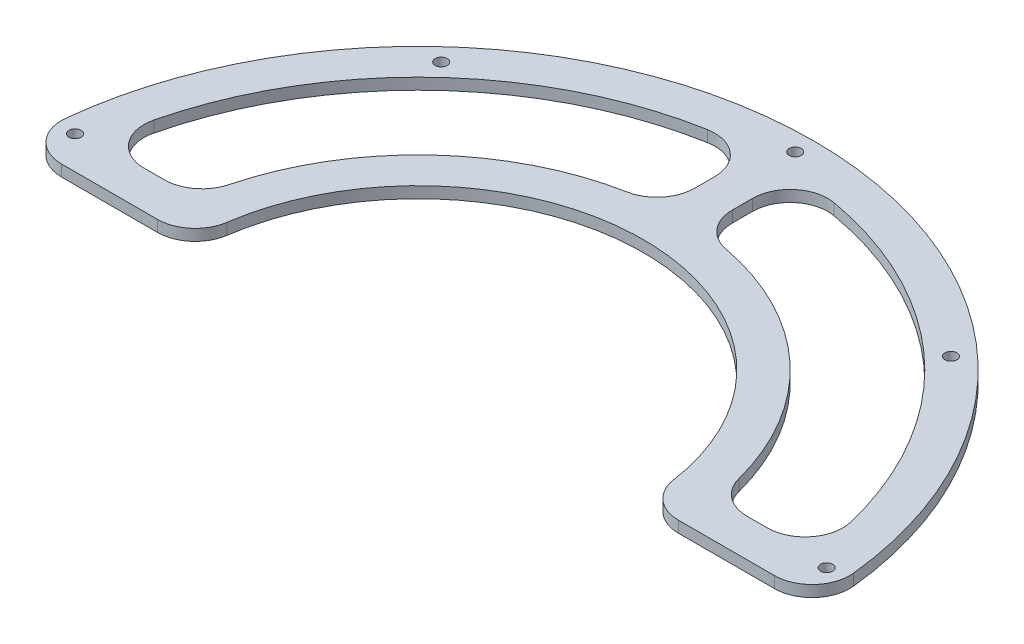
ISO-10303-21;
HEADER;
FILE_DESCRIPTION(('STEP AP214'),'2;1');
FILE_NAME('part.step','',(''),(''),'','','');
FILE_SCHEMA(('AUTOMOTIVE_DESIGN { 1 0 10303 214 1 1 1 1 }'));
ENDSEC;
DATA;
#1=APPLICATION_CONTEXT('core data for automotive mechanical design processes');
#2=APPLICATION_PROTOCOL_DEFINITION('international standard','automotive_design',2000,#1);
#3=PRODUCT_CONTEXT('',#1,'mechanical');
#4=PRODUCT('Part','Part','',(#3));
#5=PRODUCT_RELATED_PRODUCT_CATEGORY('part','',(#4));
#6=PRODUCT_DEFINITION_FORMATION('','',#4);
#7=PRODUCT_DEFINITION_CONTEXT('part definition',#1,'design');
#8=PRODUCT_DEFINITION('design','',#6,#7);
#9=PRODUCT_DEFINITION_SHAPE('','',#8);
#10=(LENGTH_UNIT() NAMED_UNIT(*) SI_UNIT(.MILLI.,.METRE.));
#11=(NAMED_UNIT(*) PLANE_ANGLE_UNIT() SI_UNIT($,.RADIAN.));
#12=(NAMED_UNIT(*) SI_UNIT($,.STERADIAN.) SOLID_ANGLE_UNIT());
#13=UNCERTAINTY_MEASURE_WITH_UNIT(LENGTH_MEASURE(1.E-05),#10,'distance_accuracy_value','');
#14=(GEOMETRIC_REPRESENTATION_CONTEXT(3) GLOBAL_UNCERTAINTY_ASSIGNED_CONTEXT((#13)) GLOBAL_UNIT_ASSIGNED_CONTEXT((#10,
#11,#12)) REPRESENTATION_CONTEXT('',''));
#15=CARTESIAN_POINT('',(0.,0.,0.));
#16=DIRECTION('',(0.,0.,1.));
#17=DIRECTION('',(1.,0.,0.));
#18=AXIS2_PLACEMENT_3D('',#15,#16,#17);
#19=CARTESIAN_POINT('',(15.,3.,-83.6660026534075));
#20=DIRECTION('',(0.,-1.,0.));
#21=DIRECTION('',(0.,0.,-1.));
#22=AXIS2_PLACEMENT_3D('',#19,#20,#21);
#23=CYLINDRICAL_SURFACE('',#22,9.99999999999999);
#24=CARTESIAN_POINT('',(15.,0.,-83.6660026534075));
#25=DIRECTION('',(0.,1.,0.));
#26=DIRECTION('',(0.,0.,1.));
#27=AXIS2_PLACEMENT_3D('',#24,#25,#26);
#28=CIRCLE('',#27,9.99999999999999);
#29=CARTESIAN_POINT('',(16.764705882353,0.,-93.5090617891025));
#30=VERTEX_POINT('',#29);
#31=CARTESIAN_POINT('',(5.,0.,-83.6660026534075));
#32=VERTEX_POINT('',#31);
#33=EDGE_CURVE('E353',#30,#32,#28,.T.);
#34=ORIENTED_EDGE('',*,*,#33,.F.);
#35=DIRECTION('',(0.,-1.,0.));
#36=VECTOR('',#35,1.);
#37=CARTESIAN_POINT('',(16.764705882353,3.,-93.5090617891025));
#38=LINE('',#37,#36);
#39=CARTESIAN_POINT('',(16.764705882353,3.,-93.5090617891025));
#40=VERTEX_POINT('',#39);
#41=EDGE_CURVE('E11',#40,#30,#38,.T.);
#42=ORIENTED_EDGE('',*,*,#41,.F.);
#43=CARTESIAN_POINT('',(15.,3.,-83.6660026534075));
#44=DIRECTION('',(0.,1.,0.));
#45=DIRECTION('',(0.,0.,1.));
#46=AXIS2_PLACEMENT_3D('',#43,#44,#45);
#47=CIRCLE('',#46,9.99999999999999);
#48=CARTESIAN_POINT('',(5.,3.,-83.6660026534075));
#49=VERTEX_POINT('',#48);
#50=EDGE_CURVE('E427',#40,#49,#47,.T.);
#51=ORIENTED_EDGE('',*,*,#50,.T.);
#52=DIRECTION('',(0.,-1.,0.));
#53=VECTOR('',#52,1.);
#54=CARTESIAN_POINT('',(5.,3.,-83.6660026534075));
#55=LINE('',#54,#53);
#56=EDGE_CURVE('E142',#49,#32,#55,.T.);
#57=ORIENTED_EDGE('',*,*,#56,.T.);
#58=EDGE_LOOP('',(#34,#42,#51,#57));
#59=FACE_BOUND('',#58,.T.);
#60=ADVANCED_FACE('F41',(#59),#23,.F.);
#61=CARTESIAN_POINT('',(0.,3.,0.));
#62=DIRECTION('',(0.,-1.,0.));
#63=DIRECTION('',(0.,0.,-1.));
#64=AXIS2_PLACEMENT_3D('',#61,#62,#63);
#65=CYLINDRICAL_SURFACE('',#64,95.);
#66=CARTESIAN_POINT('',(0.,0.,0.));
#67=DIRECTION('',(0.,1.,0.));
#68=DIRECTION('',(0.,0.,1.));
#69=AXIS2_PLACEMENT_3D('',#66,#67,#68);
#70=CIRCLE('',#69,95.);
#71=CARTESIAN_POINT('',(92.3328003515611,0.,-22.3529411764706));
#72=VERTEX_POINT('',#71);
#73=EDGE_CURVE('E355',#72,#30,#70,.T.);
#74=ORIENTED_EDGE('',*,*,#73,.F.);
#75=DIRECTION('',(0.,-1.,0.));
#76=VECTOR('',#75,1.);
#77=CARTESIAN_POINT('',(92.3328003515611,3.,-22.3529411764706));
#78=LINE('',#77,#76);
#79=CARTESIAN_POINT('',(92.3328003515611,3.,-22.3529411764706));
#80=VERTEX_POINT('',#79);
#81=EDGE_CURVE('E51',#80,#72,#78,.T.);
#82=ORIENTED_EDGE('',*,*,#81,.F.);
#83=CARTESIAN_POINT('',(0.,3.,0.));
#84=DIRECTION('',(0.,1.,0.));
#85=DIRECTION('',(0.,0.,1.));
#86=AXIS2_PLACEMENT_3D('',#83,#84,#85);
#87=CIRCLE('',#86,95.);
#88=EDGE_CURVE('E429',#80,#40,#87,.T.);
#89=ORIENTED_EDGE('',*,*,#88,.T.);
#90=ORIENTED_EDGE('',*,*,#41,.T.);
#91=EDGE_LOOP('',(#74,#82,#89,#90));
#92=FACE_BOUND('',#91,.T.);
#93=ADVANCED_FACE('F459',(#92),#65,.F.);
#94=CARTESIAN_POINT('',(82.6135582092915,3.,-20.));
#95=DIRECTION('',(0.,-1.,0.));
#96=DIRECTION('',(0.,0.,-1.));
#97=AXIS2_PLACEMENT_3D('',#94,#95,#96);
#98=CYLINDRICAL_SURFACE('',#97,10.);
#99=CARTESIAN_POINT('',(82.6135582092915,0.,-20.));
#100=DIRECTION('',(0.,1.,0.));
#101=DIRECTION('',(0.,0.,1.));
#102=AXIS2_PLACEMENT_3D('',#99,#100,#101);
#103=CIRCLE('',#102,10.);
#104=CARTESIAN_POINT('',(82.6135582092915,0.,-10.));
#105=VERTEX_POINT('',#104);
#106=EDGE_CURVE('E358',#105,#72,#103,.T.);
#107=ORIENTED_EDGE('',*,*,#106,.F.);
#108=DIRECTION('',(0.,-1.,0.));
#109=VECTOR('',#108,1.);
#110=CARTESIAN_POINT('',(82.6135582092915,3.,-10.));
#111=LINE('',#110,#109);
#112=CARTESIAN_POINT('',(82.6135582092915,3.,-10.));
#113=VERTEX_POINT('',#112);
#114=EDGE_CURVE('E242',#113,#105,#111,.T.);
#115=ORIENTED_EDGE('',*,*,#114,.F.);
#116=CARTESIAN_POINT('',(82.6135582092915,3.,-20.));
#117=DIRECTION('',(0.,1.,0.));
#118=DIRECTION('',(0.,0.,1.));
#119=AXIS2_PLACEMENT_3D('',#116,#117,#118);
#120=CIRCLE('',#119,10.);
#121=EDGE_CURVE('E432',#113,#80,#120,.T.);
#122=ORIENTED_EDGE('',*,*,#121,.T.);
#123=ORIENTED_EDGE('',*,*,#81,.T.);
#124=EDGE_LOOP('',(#107,#115,#122,#123));
#125=FACE_BOUND('',#124,.T.);
#126=ADVANCED_FACE('F445',(#125),#98,.F.);
#127=CARTESIAN_POINT('',(0.,3.,-10.));
#128=DIRECTION('',(0.,0.,-1.));
#129=DIRECTION('',(-1.,0.,0.));
#130=AXIS2_PLACEMENT_3D('',#127,#128,#129);
#131=PLANE('',#130);
#132=DIRECTION('',(1.,0.,0.));
#133=VECTOR('',#132,1.);
#134=CARTESIAN_POINT('',(0.,0.,-10.));
#135=LINE('',#134,#133);
#136=CARTESIAN_POINT('',(77.2221011110161,0.,-10.));
#137=VERTEX_POINT('',#136);
#138=EDGE_CURVE('E361',#137,#105,#135,.T.);
#139=ORIENTED_EDGE('',*,*,#138,.F.);
#140=DIRECTION('',(0.,-1.,0.));
#141=VECTOR('',#140,1.);
#142=CARTESIAN_POINT('',(77.2221011110161,3.,-10.));
#143=LINE('',#142,#141);
#144=CARTESIAN_POINT('',(77.2221011110161,3.,-10.));
#145=VERTEX_POINT('',#144);
#146=EDGE_CURVE('E236',#145,#137,#143,.T.);
#147=ORIENTED_EDGE('',*,*,#146,.F.);
#148=DIRECTION('',(1.,0.,0.));
#149=VECTOR('',#148,1.);
#150=CARTESIAN_POINT('',(0.,3.,-10.));
#151=LINE('',#150,#149);
#152=EDGE_CURVE('E435',#145,#113,#151,.T.);
#153=ORIENTED_EDGE('',*,*,#152,.T.);
#154=ORIENTED_EDGE('',*,*,#114,.T.);
#155=EDGE_LOOP('',(#139,#147,#153,#154));
#156=FACE_BOUND('',#155,.T.);
#157=ADVANCED_FACE('F440',(#156),#131,.T.);
#158=CARTESIAN_POINT('',(77.2221011110161,3.,-20.));
#159=DIRECTION('',(0.,-1.,0.));
#160=DIRECTION('',(0.,0.,-1.));
#161=AXIS2_PLACEMENT_3D('',#158,#159,#160);
#162=CYLINDRICAL_SURFACE('',#161,9.99999999999999);
#163=CARTESIAN_POINT('',(77.2221011110161,0.,-20.));
#164=DIRECTION('',(0.,1.,0.));
#165=DIRECTION('',(0.,0.,1.));
#166=AXIS2_PLACEMENT_3D('',#163,#164,#165);
#167=CIRCLE('',#166,9.99999999999999);
#168=CARTESIAN_POINT('',(67.5415067633897,0.,-17.492791776357));
#169=VERTEX_POINT('',#168);
#170=EDGE_CURVE('E364',#137,#169,#167,.F.);
#171=ORIENTED_EDGE('',*,*,#170,.T.);
#172=DIRECTION('',(0.,-1.,0.));
#173=VECTOR('',#172,1.);
#174=CARTESIAN_POINT('',(67.5415067633897,3.,-17.492791776357));
#175=LINE('',#174,#173);
#176=CARTESIAN_POINT('',(67.5415067633897,3.,-17.492791776357));
#177=VERTEX_POINT('',#176);
#178=EDGE_CURVE('E234',#177,#169,#175,.T.);
#179=ORIENTED_EDGE('',*,*,#178,.F.);
#180=CARTESIAN_POINT('',(77.2221011110161,3.,-20.));
#181=DIRECTION('',(0.,1.,0.));
#182=DIRECTION('',(0.,0.,1.));
#183=AXIS2_PLACEMENT_3D('',#180,#181,#182);
#184=CIRCLE('',#183,9.99999999999999);
#185=EDGE_CURVE('E227',#145,#177,#184,.F.);
#186=ORIENTED_EDGE('',*,*,#185,.F.);
#187=ORIENTED_EDGE('',*,*,#146,.T.);
#188=EDGE_LOOP('',(#171,#179,#186,#187));
#189=FACE_BOUND('',#188,.T.);
#190=ADVANCED_FACE('F449',(#189),#162,.F.);
#191=CARTESIAN_POINT('',(0.,3.,0.));
#192=DIRECTION('',(0.,-1.,0.));
#193=DIRECTION('',(0.,0.,-1.));
#194=AXIS2_PLACEMENT_3D('',#191,#192,#193);
#195=CYLINDRICAL_SURFACE('',#194,69.77);
#196=CARTESIAN_POINT('',(0.,0.,0.));
#197=DIRECTION('',(0.,1.,0.));
#198=DIRECTION('',(0.,0.,1.));
#199=AXIS2_PLACEMENT_3D('',#196,#197,#198);
#200=CIRCLE('',#199,69.77);
#201=CARTESIAN_POINT('',(13.1195938322678,0.,-68.5253906057916));
#202=VERTEX_POINT('',#201);
#203=EDGE_CURVE('E233',#169,#202,#200,.T.);
#204=ORIENTED_EDGE('',*,*,#203,.T.);
#205=DIRECTION('',(0.,-1.,0.));
#206=VECTOR('',#205,1.);
#207=CARTESIAN_POINT('',(13.1195938322678,3.,-68.5253906057916));
#208=LINE('',#207,#206);
#209=CARTESIAN_POINT('',(13.1195938322678,3.,-68.5253906057916));
#210=VERTEX_POINT('',#209);
#211=EDGE_CURVE('E218',#210,#202,#208,.T.);
#212=ORIENTED_EDGE('',*,*,#211,.F.);
#213=CARTESIAN_POINT('',(0.,3.,0.));
#214=DIRECTION('',(0.,1.,0.));
#215=DIRECTION('',(0.,0.,1.));
#216=AXIS2_PLACEMENT_3D('',#213,#214,#215);
#217=CIRCLE('',#216,69.77);
#218=EDGE_CURVE('E221',#177,#210,#217,.T.);
#219=ORIENTED_EDGE('',*,*,#218,.F.);
#220=ORIENTED_EDGE('',*,*,#178,.T.);
#221=EDGE_LOOP('',(#204,#212,#219,#220));
#222=FACE_BOUND('',#221,.T.);
#223=ADVANCED_FACE('F232',(#222),#195,.T.);
#224=CARTESIAN_POINT('',(15.,3.,-78.3470031334958));
#225=DIRECTION('',(0.,-1.,0.));
#226=DIRECTION('',(0.,0.,-1.));
#227=AXIS2_PLACEMENT_3D('',#224,#225,#226);
#228=CYLINDRICAL_SURFACE('',#227,9.99999999999999);
#229=CARTESIAN_POINT('',(15.,0.,-78.3470031334958));
#230=DIRECTION('',(0.,1.,0.));
#231=DIRECTION('',(0.,0.,1.));
#232=AXIS2_PLACEMENT_3D('',#229,#230,#231);
#233=CIRCLE('',#232,9.99999999999999);
#234=CARTESIAN_POINT('',(5.,0.,-78.3470031334958));
#235=VERTEX_POINT('',#234);
#236=EDGE_CURVE('E368',#202,#235,#233,.F.);
#237=ORIENTED_EDGE('',*,*,#236,.T.);
#238=DIRECTION('',(0.,-1.,0.));
#239=VECTOR('',#238,1.);
#240=CARTESIAN_POINT('',(5.,3.,-78.3470031334958));
#241=LINE('',#240,#239);
#242=CARTESIAN_POINT('',(5.,3.,-78.3470031334958));
#243=VERTEX_POINT('',#242);
#244=EDGE_CURVE('E220',#243,#235,#241,.T.);
#245=ORIENTED_EDGE('',*,*,#244,.F.);
#246=CARTESIAN_POINT('',(15.,3.,-78.3470031334958));
#247=DIRECTION('',(0.,1.,0.));
#248=DIRECTION('',(0.,0.,1.));
#249=AXIS2_PLACEMENT_3D('',#246,#247,#248);
#250=CIRCLE('',#249,9.99999999999999);
#251=EDGE_CURVE('E213',#210,#243,#250,.F.);
#252=ORIENTED_EDGE('',*,*,#251,.F.);
#253=ORIENTED_EDGE('',*,*,#211,.T.);
#254=EDGE_LOOP('',(#237,#245,#252,#253));
#255=FACE_BOUND('',#254,.T.);
#256=ADVANCED_FACE('F216',(#255),#228,.F.);
#257=CARTESIAN_POINT('',(-15.,3.,-83.6660026534075));
#258=DIRECTION('',(0.,-1.,0.));
#259=DIRECTION('',(0.,0.,-1.));
#260=AXIS2_PLACEMENT_3D('',#257,#258,#259);
#261=CYLINDRICAL_SURFACE('',#260,10.);
#262=CARTESIAN_POINT('',(-15.,0.,-83.6660026534075));
#263=DIRECTION('',(0.,1.,0.));
#264=DIRECTION('',(0.,0.,1.));
#265=AXIS2_PLACEMENT_3D('',#262,#263,#264);
#266=CIRCLE('',#265,10.);
#267=CARTESIAN_POINT('',(-5.,0.,-83.6660026534075));
#268=VERTEX_POINT('',#267);
#269=CARTESIAN_POINT('',(-16.7647058823529,0.,-93.5090617891025));
#270=VERTEX_POINT('',#269);
#271=EDGE_CURVE('E329',#268,#270,#266,.T.);
#272=ORIENTED_EDGE('',*,*,#271,.F.);
#273=DIRECTION('',(0.,-1.,0.));
#274=VECTOR('',#273,1.);
#275=CARTESIAN_POINT('',(-5.,3.,-83.6660026534075));
#276=LINE('',#275,#274);
#277=CARTESIAN_POINT('',(-5.,3.,-83.6660026534075));
#278=VERTEX_POINT('',#277);
#279=EDGE_CURVE('E260',#278,#268,#276,.T.);
#280=ORIENTED_EDGE('',*,*,#279,.F.);
#281=CARTESIAN_POINT('',(-15.,3.,-83.6660026534075));
#282=DIRECTION('',(0.,1.,0.));
#283=DIRECTION('',(0.,0.,1.));
#284=AXIS2_PLACEMENT_3D('',#281,#282,#283);
#285=CIRCLE('',#284,10.);
#286=CARTESIAN_POINT('',(-16.7647058823529,3.,-93.5090617891025));
#287=VERTEX_POINT('',#286);
#288=EDGE_CURVE('E405',#278,#287,#285,.T.);
#289=ORIENTED_EDGE('',*,*,#288,.T.);
#290=DIRECTION('',(0.,-1.,0.));
#291=VECTOR('',#290,1.);
#292=CARTESIAN_POINT('',(-16.7647058823529,3.,-93.5090617891025));
#293=LINE('',#292,#291);
#294=EDGE_CURVE('E245',#287,#270,#293,.T.);
#295=ORIENTED_EDGE('',*,*,#294,.T.);
#296=EDGE_LOOP('',(#272,#280,#289,#295));
#297=FACE_BOUND('',#296,.T.);
#298=ADVANCED_FACE('F497',(#297),#261,.F.);
#299=CARTESIAN_POINT('',(-5.,3.,0.));
#300=DIRECTION('',(-1.,0.,0.));
#301=DIRECTION('',(0.,0.,1.));
#302=AXIS2_PLACEMENT_3D('',#299,#300,#301);
#303=PLANE('',#302);
#304=DIRECTION('',(0.,0.,-1.));
#305=VECTOR('',#304,1.);
#306=CARTESIAN_POINT('',(-5.,0.,0.));
#307=LINE('',#306,#305);
#308=CARTESIAN_POINT('',(-5.,0.,-78.3470031334958));
#309=VERTEX_POINT('',#308);
#310=EDGE_CURVE('E332',#309,#268,#307,.T.);
#311=ORIENTED_EDGE('',*,*,#310,.F.);
#312=DIRECTION('',(0.,-1.,0.));
#313=VECTOR('',#312,1.);
#314=CARTESIAN_POINT('',(-5.,3.,-78.3470031334958));
#315=LINE('',#314,#313);
#316=CARTESIAN_POINT('',(-5.,3.,-78.3470031334958));
#317=VERTEX_POINT('',#316);
#318=EDGE_CURVE('E258',#317,#309,#315,.T.);
#319=ORIENTED_EDGE('',*,*,#318,.F.);
#320=DIRECTION('',(0.,0.,-1.));
#321=VECTOR('',#320,1.);
#322=CARTESIAN_POINT('',(-5.,3.,0.));
#323=LINE('',#322,#321);
#324=EDGE_CURVE('E408',#317,#278,#323,.T.);
#325=ORIENTED_EDGE('',*,*,#324,.T.);
#326=ORIENTED_EDGE('',*,*,#279,.T.);
#327=EDGE_LOOP('',(#311,#319,#325,#326));
#328=FACE_BOUND('',#327,.T.);
#329=ADVANCED_FACE('F493',(#328),#303,.T.);
#330=CARTESIAN_POINT('',(-15.,3.,-78.3470031334958));
#331=DIRECTION('',(0.,-1.,0.));
#332=DIRECTION('',(0.,0.,-1.));
#333=AXIS2_PLACEMENT_3D('',#330,#331,#332);
#334=CYLINDRICAL_SURFACE('',#333,9.99999999999999);
#335=CARTESIAN_POINT('',(-15.,0.,-78.3470031334958));
#336=DIRECTION('',(0.,1.,0.));
#337=DIRECTION('',(0.,0.,1.));
#338=AXIS2_PLACEMENT_3D('',#335,#336,#337);
#339=CIRCLE('',#338,9.99999999999999);
#340=CARTESIAN_POINT('',(-13.1195938322678,0.,-68.5253906057917));
#341=VERTEX_POINT('',#340);
#342=EDGE_CURVE('E335',#309,#341,#339,.F.);
#343=ORIENTED_EDGE('',*,*,#342,.T.);
#344=DIRECTION('',(0.,-1.,0.));
#345=VECTOR('',#344,1.);
#346=CARTESIAN_POINT('',(-13.1195938322678,3.,-68.5253906057917));
#347=LINE('',#346,#345);
#348=CARTESIAN_POINT('',(-13.1195938322678,3.,-68.5253906057917));
#349=VERTEX_POINT('',#348);
#350=EDGE_CURVE('E255',#349,#341,#347,.T.);
#351=ORIENTED_EDGE('',*,*,#350,.F.);
#352=CARTESIAN_POINT('',(-15.,3.,-78.3470031334958));
#353=DIRECTION('',(0.,1.,0.));
#354=DIRECTION('',(0.,0.,1.));
#355=AXIS2_PLACEMENT_3D('',#352,#353,#354);
#356=CIRCLE('',#355,9.99999999999999);
#357=EDGE_CURVE('E411',#317,#349,#356,.F.);
#358=ORIENTED_EDGE('',*,*,#357,.F.);
#359=ORIENTED_EDGE('',*,*,#318,.T.);
#360=EDGE_LOOP('',(#343,#351,#358,#359));
#361=FACE_BOUND('',#360,.T.);
#362=ADVANCED_FACE('F489',(#361),#334,.F.);
#363=CARTESIAN_POINT('',(0.,3.,0.));
#364=DIRECTION('',(0.,-1.,0.));
#365=DIRECTION('',(0.,0.,-1.));
#366=AXIS2_PLACEMENT_3D('',#363,#364,#365);
#367=CYLINDRICAL_SURFACE('',#366,69.77);
#368=CARTESIAN_POINT('',(0.,0.,0.));
#369=DIRECTION('',(0.,1.,0.));
#370=DIRECTION('',(0.,0.,1.));
#371=AXIS2_PLACEMENT_3D('',#368,#369,#370);
#372=CIRCLE('',#371,69.77);
#373=CARTESIAN_POINT('',(-67.5415067633897,0.,-17.492791776357));
#374=VERTEX_POINT('',#373);
#375=EDGE_CURVE('E338',#341,#374,#372,.T.);
#376=ORIENTED_EDGE('',*,*,#375,.T.);
#377=DIRECTION('',(0.,-1.,0.));
#378=VECTOR('',#377,1.);
#379=CARTESIAN_POINT('',(-67.5415067633897,3.,-17.492791776357));
#380=LINE('',#379,#378);
#381=CARTESIAN_POINT('',(-67.5415067633897,3.,-17.492791776357));
#382=VERTEX_POINT('',#381);
#383=EDGE_CURVE('E253',#382,#374,#380,.T.);
#384=ORIENTED_EDGE('',*,*,#383,.F.);
#385=CARTESIAN_POINT('',(0.,3.,0.));
#386=DIRECTION('',(0.,1.,0.));
#387=DIRECTION('',(0.,0.,1.));
#388=AXIS2_PLACEMENT_3D('',#385,#386,#387);
#389=CIRCLE('',#388,69.77);
#390=EDGE_CURVE('E414',#349,#382,#389,.T.);
#391=ORIENTED_EDGE('',*,*,#390,.F.);
#392=ORIENTED_EDGE('',*,*,#350,.T.);
#393=EDGE_LOOP('',(#376,#384,#391,#392));
#394=FACE_BOUND('',#393,.T.);
#395=ADVANCED_FACE('F485',(#394),#367,.T.);
#396=CARTESIAN_POINT('',(-77.2221011110161,3.,-20.));
#397=DIRECTION('',(0.,-1.,0.));
#398=DIRECTION('',(0.,0.,-1.));
#399=AXIS2_PLACEMENT_3D('',#396,#397,#398);
#400=CYLINDRICAL_SURFACE('',#399,9.99999999999999);
#401=CARTESIAN_POINT('',(-77.2221011110161,0.,-20.));
#402=DIRECTION('',(0.,1.,0.));
#403=DIRECTION('',(0.,0.,1.));
#404=AXIS2_PLACEMENT_3D('',#401,#402,#403);
#405=CIRCLE('',#404,9.99999999999999);
#406=CARTESIAN_POINT('',(-77.2221011110161,0.,-10.));
#407=VERTEX_POINT('',#406);
#408=EDGE_CURVE('E341',#407,#374,#405,.T.);
#409=ORIENTED_EDGE('',*,*,#408,.F.);
#410=DIRECTION('',(0.,-1.,0.));
#411=VECTOR('',#410,1.);
#412=CARTESIAN_POINT('',(-77.2221011110161,3.,-10.));
#413=LINE('',#412,#411);
#414=CARTESIAN_POINT('',(-77.2221011110161,3.,-10.));
#415=VERTEX_POINT('',#414);
#416=EDGE_CURVE('E251',#415,#407,#413,.T.);
#417=ORIENTED_EDGE('',*,*,#416,.F.);
#418=CARTESIAN_POINT('',(-77.2221011110161,3.,-20.));
#419=DIRECTION('',(0.,1.,0.));
#420=DIRECTION('',(0.,0.,1.));
#421=AXIS2_PLACEMENT_3D('',#418,#419,#420);
#422=CIRCLE('',#421,9.99999999999999);
#423=EDGE_CURVE('E416',#415,#382,#422,.T.);
#424=ORIENTED_EDGE('',*,*,#423,.T.);
#425=ORIENTED_EDGE('',*,*,#383,.T.);
#426=EDGE_LOOP('',(#409,#417,#424,#425));
#427=FACE_BOUND('',#426,.T.);
#428=ADVANCED_FACE('F481',(#427),#400,.F.);
#429=CARTESIAN_POINT('',(0.,3.,-10.));
#430=DIRECTION('',(0.,0.,-1.));
#431=DIRECTION('',(-1.,0.,0.));
#432=AXIS2_PLACEMENT_3D('',#429,#430,#431);
#433=PLANE('',#432);
#434=DIRECTION('',(1.,0.,0.));
#435=VECTOR('',#434,1.);
#436=CARTESIAN_POINT('',(0.,0.,-10.));
#437=LINE('',#436,#435);
#438=CARTESIAN_POINT('',(-82.6135582092915,0.,-10.));
#439=VERTEX_POINT('',#438);
#440=EDGE_CURVE('E344',#439,#407,#437,.T.);
#441=ORIENTED_EDGE('',*,*,#440,.F.);
#442=DIRECTION('',(0.,-1.,0.));
#443=VECTOR('',#442,1.);
#444=CARTESIAN_POINT('',(-82.6135582092915,3.,-10.));
#445=LINE('',#444,#443);
#446=CARTESIAN_POINT('',(-82.6135582092915,3.,-10.));
#447=VERTEX_POINT('',#446);
#448=EDGE_CURVE('E249',#447,#439,#445,.T.);
#449=ORIENTED_EDGE('',*,*,#448,.F.);
#450=DIRECTION('',(1.,0.,0.));
#451=VECTOR('',#450,1.);
#452=CARTESIAN_POINT('',(0.,3.,-10.));
#453=LINE('',#452,#451);
#454=EDGE_CURVE('E419',#447,#415,#453,.T.);
#455=ORIENTED_EDGE('',*,*,#454,.T.);
#456=ORIENTED_EDGE('',*,*,#416,.T.);
#457=EDGE_LOOP('',(#441,#449,#455,#456));
#458=FACE_BOUND('',#457,.T.);
#459=ADVANCED_FACE('F477',(#458),#433,.T.);
#460=CARTESIAN_POINT('',(-82.6135582092915,3.,-20.));
#461=DIRECTION('',(0.,-1.,0.));
#462=DIRECTION('',(0.,0.,-1.));
#463=AXIS2_PLACEMENT_3D('',#460,#461,#462);
#464=CYLINDRICAL_SURFACE('',#463,10.);
#465=CARTESIAN_POINT('',(-82.6135582092915,0.,-20.));
#466=DIRECTION('',(0.,1.,0.));
#467=DIRECTION('',(0.,0.,1.));
#468=AXIS2_PLACEMENT_3D('',#465,#466,#467);
#469=CIRCLE('',#468,10.);
#470=CARTESIAN_POINT('',(-92.3328003515611,0.,-22.3529411764707));
#471=VERTEX_POINT('',#470);
#472=EDGE_CURVE('E347',#439,#471,#469,.F.);
#473=ORIENTED_EDGE('',*,*,#472,.T.);
#474=DIRECTION('',(0.,-1.,0.));
#475=VECTOR('',#474,1.);
#476=CARTESIAN_POINT('',(-92.3328003515611,3.,-22.3529411764707));
#477=LINE('',#476,#475);
#478=CARTESIAN_POINT('',(-92.3328003515611,3.,-22.3529411764707));
#479=VERTEX_POINT('',#478);
#480=EDGE_CURVE('E247',#479,#471,#477,.T.);
#481=ORIENTED_EDGE('',*,*,#480,.F.);
#482=CARTESIAN_POINT('',(-82.6135582092915,3.,-20.));
#483=DIRECTION('',(0.,1.,0.));
#484=DIRECTION('',(0.,0.,1.));
#485=AXIS2_PLACEMENT_3D('',#482,#483,#484);
#486=CIRCLE('',#485,10.);
#487=EDGE_CURVE('E422',#447,#479,#486,.F.);
#488=ORIENTED_EDGE('',*,*,#487,.F.);
#489=ORIENTED_EDGE('',*,*,#448,.T.);
#490=EDGE_LOOP('',(#473,#481,#488,#489));
#491=FACE_BOUND('',#490,.T.);
#492=ADVANCED_FACE('F474',(#491),#464,.F.);
#493=CARTESIAN_POINT('',(-69.0496408390369,3.,-10.));
#494=DIRECTION('',(0.,-1.,0.));
#495=DIRECTION('',(0.,0.,-1.));
#496=AXIS2_PLACEMENT_3D('',#493,#494,#495);
#497=CYLINDRICAL_SURFACE('',#496,10.);
#498=CARTESIAN_POINT('',(-69.0496408390369,0.,-10.));
#499=DIRECTION('',(0.,1.,0.));
#500=DIRECTION('',(0.,0.,1.));
#501=AXIS2_PLACEMENT_3D('',#498,#499,#500);
#502=CIRCLE('',#501,10.);
#503=CARTESIAN_POINT('',(-59.1528885330262,0.,-8.56671922029527));
#504=VERTEX_POINT('',#503);
#505=CARTESIAN_POINT('',(-69.0496408390369,0.,0.));
#506=VERTEX_POINT('',#505);
#507=EDGE_CURVE('E287',#504,#506,#502,.F.);
#508=ORIENTED_EDGE('',*,*,#507,.F.);
#509=DIRECTION('',(0.,-1.,0.));
#510=VECTOR('',#509,1.);
#511=CARTESIAN_POINT('',(-59.1528885330262,3.,-8.56671922029527));
#512=LINE('',#511,#510);
#513=CARTESIAN_POINT('',(-59.1528885330262,3.,-8.56671922029527));
#514=VERTEX_POINT('',#513);
#515=EDGE_CURVE('E45',#514,#504,#512,.T.);
#516=ORIENTED_EDGE('',*,*,#515,.F.);
#517=CARTESIAN_POINT('',(-69.0496408390369,3.,-10.));
#518=DIRECTION('',(0.,1.,0.));
#519=DIRECTION('',(0.,0.,1.));
#520=AXIS2_PLACEMENT_3D('',#517,#518,#519);
#521=CIRCLE('',#520,10.);
#522=CARTESIAN_POINT('',(-69.0496408390369,3.,0.));
#523=VERTEX_POINT('',#522);
#524=EDGE_CURVE('E370',#514,#523,#521,.F.);
#525=ORIENTED_EDGE('',*,*,#524,.T.);
#526=DIRECTION('',(0.,-1.,0.));
#527=VECTOR('',#526,1.);
#528=CARTESIAN_POINT('',(-69.0496408390369,3.,0.));
#529=LINE('',#528,#527);
#530=EDGE_CURVE('E262',#523,#506,#529,.T.);
#531=ORIENTED_EDGE('',*,*,#530,.T.);
#532=EDGE_LOOP('',(#508,#516,#525,#531));
#533=FACE_BOUND('',#532,.T.);
#534=ADVANCED_FACE('F43',(#533),#497,.T.);
#535=CARTESIAN_POINT('',(0.,3.,0.));
#536=DIRECTION('',(0.,-1.,0.));
#537=DIRECTION('',(0.,0.,-1.));
#538=AXIS2_PLACEMENT_3D('',#535,#536,#537);
#539=CYLINDRICAL_SURFACE('',#538,59.77);
#540=CARTESIAN_POINT('',(0.,0.,0.));
#541=DIRECTION('',(0.,1.,0.));
#542=DIRECTION('',(0.,0.,1.));
#543=AXIS2_PLACEMENT_3D('',#540,#541,#542);
#544=CIRCLE('',#543,59.77);
#545=CARTESIAN_POINT('',(59.1528885330262,0.,-8.56671922029525));
#546=VERTEX_POINT('',#545);
#547=EDGE_CURVE('E283',#546,#504,#544,.T.);
#548=ORIENTED_EDGE('',*,*,#547,.F.);
#549=DIRECTION('',(0.,-1.,0.));
#550=VECTOR('',#549,1.);
#551=CARTESIAN_POINT('',(59.1528885330262,3.,-8.56671922029525));
#552=LINE('',#551,#550);
#553=CARTESIAN_POINT('',(59.1528885330262,3.,-8.56671922029525));
#554=VERTEX_POINT('',#553);
#555=EDGE_CURVE('E273',#554,#546,#552,.T.);
#556=ORIENTED_EDGE('',*,*,#555,.F.);
#557=CARTESIAN_POINT('',(0.,3.,0.));
#558=DIRECTION('',(0.,1.,0.));
#559=DIRECTION('',(0.,0.,1.));
#560=AXIS2_PLACEMENT_3D('',#557,#558,#559);
#561=CIRCLE('',#560,59.77);
#562=EDGE_CURVE('E285',#554,#514,#561,.T.);
#563=ORIENTED_EDGE('',*,*,#562,.T.);
#564=ORIENTED_EDGE('',*,*,#515,.T.);
#565=EDGE_LOOP('',(#548,#556,#563,#564));
#566=FACE_BOUND('',#565,.T.);
#567=ADVANCED_FACE('F281',(#566),#539,.F.);
#568=CARTESIAN_POINT('',(69.0496408390369,3.,-10.));
#569=DIRECTION('',(0.,-1.,0.));
#570=DIRECTION('',(0.,0.,-1.));
#571=AXIS2_PLACEMENT_3D('',#568,#569,#570);
#572=CYLINDRICAL_SURFACE('',#571,10.);
#573=CARTESIAN_POINT('',(69.0496408390369,0.,-10.));
#574=DIRECTION('',(0.,1.,0.));
#575=DIRECTION('',(0.,0.,1.));
#576=AXIS2_PLACEMENT_3D('',#573,#574,#575);
#577=CIRCLE('',#576,10.);
#578=CARTESIAN_POINT('',(69.0496408390369,0.,0.));
#579=VERTEX_POINT('',#578);
#580=EDGE_CURVE('E296',#546,#579,#577,.T.);
#581=ORIENTED_EDGE('',*,*,#580,.T.);
#582=DIRECTION('',(0.,-1.,0.));
#583=VECTOR('',#582,1.);
#584=CARTESIAN_POINT('',(69.0496408390369,3.,0.));
#585=LINE('',#584,#583);
#586=CARTESIAN_POINT('',(69.0496408390369,3.,0.));
#587=VERTEX_POINT('',#586);
#588=EDGE_CURVE('E272',#587,#579,#585,.T.);
#589=ORIENTED_EDGE('',*,*,#588,.F.);
#590=CARTESIAN_POINT('',(69.0496408390369,3.,-10.));
#591=DIRECTION('',(0.,1.,0.));
#592=DIRECTION('',(0.,0.,1.));
#593=AXIS2_PLACEMENT_3D('',#590,#591,#592);
#594=CIRCLE('',#593,10.);
#595=EDGE_CURVE('E373',#554,#587,#594,.T.);
#596=ORIENTED_EDGE('',*,*,#595,.F.);
#597=ORIENTED_EDGE('',*,*,#555,.T.);
#598=EDGE_LOOP('',(#581,#589,#596,#597));
#599=FACE_BOUND('',#598,.T.);
#600=ADVANCED_FACE('F540',(#599),#572,.T.);
#601=CARTESIAN_POINT('',(0.,3.,0.));
#602=DIRECTION('',(0.,0.,1.));
#603=DIRECTION('',(1.,0.,0.));
#604=AXIS2_PLACEMENT_3D('',#601,#602,#603);
#605=PLANE('',#604);
#606=DIRECTION('',(-1.,0.,0.));
#607=VECTOR('',#606,1.);
#608=CARTESIAN_POINT('',(0.,0.,0.));
#609=LINE('',#608,#607);
#610=CARTESIAN_POINT('',(94.4722181384559,0.,0.));
#611=VERTEX_POINT('',#610);
#612=EDGE_CURVE('E298',#611,#579,#609,.T.);
#613=ORIENTED_EDGE('',*,*,#612,.F.);
#614=DIRECTION('',(0.,-1.,0.));
#615=VECTOR('',#614,1.);
#616=CARTESIAN_POINT('',(94.4722181384559,3.,0.));
#617=LINE('',#616,#615);
#618=CARTESIAN_POINT('',(94.4722181384559,3.,0.));
#619=VERTEX_POINT('',#618);
#620=EDGE_CURVE('E270',#619,#611,#617,.T.);
#621=ORIENTED_EDGE('',*,*,#620,.F.);
#622=DIRECTION('',(-1.,0.,0.));
#623=VECTOR('',#622,1.);
#624=CARTESIAN_POINT('',(0.,3.,0.));
#625=LINE('',#624,#623);
#626=EDGE_CURVE('E377',#619,#587,#625,.T.);
#627=ORIENTED_EDGE('',*,*,#626,.T.);
#628=ORIENTED_EDGE('',*,*,#588,.T.);
#629=EDGE_LOOP('',(#613,#621,#627,#628));
#630=FACE_BOUND('',#629,.T.);
#631=ADVANCED_FACE('F536',(#630),#605,.T.);
#632=CARTESIAN_POINT('',(94.4722181384559,3.,-10.));
#633=DIRECTION('',(0.,-1.,0.));
#634=DIRECTION('',(0.,0.,-1.));
#635=AXIS2_PLACEMENT_3D('',#632,#633,#634);
#636=CYLINDRICAL_SURFACE('',#635,10.);
#637=CARTESIAN_POINT('',(94.4722181384559,0.,-10.));
#638=DIRECTION('',(0.,1.,0.));
#639=DIRECTION('',(0.,0.,1.));
#640=AXIS2_PLACEMENT_3D('',#637,#638,#639);
#641=CIRCLE('',#640,10.);
#642=CARTESIAN_POINT('',(104.41666215303,0.,-11.0526315789474));
#643=VERTEX_POINT('',#642);
#644=EDGE_CURVE('E303',#643,#611,#641,.F.);
#645=ORIENTED_EDGE('',*,*,#644,.F.);
#646=DIRECTION('',(0.,-1.,0.));
#647=VECTOR('',#646,1.);
#648=CARTESIAN_POINT('',(104.41666215303,3.,-11.0526315789474));
#649=LINE('',#648,#647);
#650=CARTESIAN_POINT('',(104.41666215303,3.,-11.0526315789474));
#651=VERTEX_POINT('',#650);
#652=EDGE_CURVE('E268',#651,#643,#649,.T.);
#653=ORIENTED_EDGE('',*,*,#652,.F.);
#654=CARTESIAN_POINT('',(94.4722181384559,3.,-10.));
#655=DIRECTION('',(0.,1.,0.));
#656=DIRECTION('',(0.,0.,1.));
#657=AXIS2_PLACEMENT_3D('',#654,#655,#656);
#658=CIRCLE('',#657,10.);
#659=EDGE_CURVE('E380',#651,#619,#658,.F.);
#660=ORIENTED_EDGE('',*,*,#659,.T.);
#661=ORIENTED_EDGE('',*,*,#620,.T.);
#662=EDGE_LOOP('',(#645,#653,#660,#661));
#663=FACE_BOUND('',#662,.T.);
#664=ADVANCED_FACE('F532',(#663),#636,.T.);
#665=CARTESIAN_POINT('',(0.,3.,0.));
#666=DIRECTION('',(0.,-1.,0.));
#667=DIRECTION('',(0.,0.,-1.));
#668=AXIS2_PLACEMENT_3D('',#665,#666,#667);
#669=CYLINDRICAL_SURFACE('',#668,105.);
#670=CARTESIAN_POINT('',(0.,0.,0.));
#671=DIRECTION('',(0.,1.,0.));
#672=DIRECTION('',(0.,0.,1.));
#673=AXIS2_PLACEMENT_3D('',#670,#671,#672);
#674=CIRCLE('',#673,105.);
#675=CARTESIAN_POINT('',(-104.41666215303,0.,-11.0526315789474));
#676=VERTEX_POINT('',#675);
#677=EDGE_CURVE('E306',#643,#676,#674,.T.);
#678=ORIENTED_EDGE('',*,*,#677,.T.);
#679=DIRECTION('',(0.,-1.,0.));
#680=VECTOR('',#679,1.);
#681=CARTESIAN_POINT('',(-104.41666215303,3.,-11.0526315789474));
#682=LINE('',#681,#680);
#683=CARTESIAN_POINT('',(-104.41666215303,3.,-11.0526315789474));
#684=VERTEX_POINT('',#683);
#685=EDGE_CURVE('E266',#684,#676,#682,.T.);
#686=ORIENTED_EDGE('',*,*,#685,.F.);
#687=CARTESIAN_POINT('',(0.,3.,0.));
#688=DIRECTION('',(0.,1.,0.));
#689=DIRECTION('',(0.,0.,1.));
#690=AXIS2_PLACEMENT_3D('',#687,#688,#689);
#691=CIRCLE('',#690,105.);
#692=EDGE_CURVE('E383',#651,#684,#691,.T.);
#693=ORIENTED_EDGE('',*,*,#692,.F.);
#694=ORIENTED_EDGE('',*,*,#652,.T.);
#695=EDGE_LOOP('',(#678,#686,#693,#694));
#696=FACE_BOUND('',#695,.T.);
#697=ADVANCED_FACE('F528',(#696),#669,.T.);
#698=CARTESIAN_POINT('',(-94.4722181384559,3.,-10.));
#699=DIRECTION('',(0.,-1.,0.));
#700=DIRECTION('',(0.,0.,-1.));
#701=AXIS2_PLACEMENT_3D('',#698,#699,#700);
#702=CYLINDRICAL_SURFACE('',#701,10.);
#703=CARTESIAN_POINT('',(-94.4722181384559,0.,-10.));
#704=DIRECTION('',(0.,1.,0.));
#705=DIRECTION('',(0.,0.,1.));
#706=AXIS2_PLACEMENT_3D('',#703,#704,#705);
#707=CIRCLE('',#706,10.);
#708=CARTESIAN_POINT('',(-94.4722181384559,0.,0.));
#709=VERTEX_POINT('',#708);
#710=EDGE_CURVE('E309',#709,#676,#707,.F.);
#711=ORIENTED_EDGE('',*,*,#710,.F.);
#712=DIRECTION('',(0.,-1.,0.));
#713=VECTOR('',#712,1.);
#714=CARTESIAN_POINT('',(-94.4722181384559,3.,0.));
#715=LINE('',#714,#713);
#716=CARTESIAN_POINT('',(-94.4722181384559,3.,0.));
#717=VERTEX_POINT('',#716);
#718=EDGE_CURVE('E264',#717,#709,#715,.T.);
#719=ORIENTED_EDGE('',*,*,#718,.F.);
#720=CARTESIAN_POINT('',(-94.4722181384559,3.,-10.));
#721=DIRECTION('',(0.,1.,0.));
#722=DIRECTION('',(0.,0.,1.));
#723=AXIS2_PLACEMENT_3D('',#720,#721,#722);
#724=CIRCLE('',#723,10.);
#725=EDGE_CURVE('E385',#717,#684,#724,.F.);
#726=ORIENTED_EDGE('',*,*,#725,.T.);
#727=ORIENTED_EDGE('',*,*,#685,.T.);
#728=EDGE_LOOP('',(#711,#719,#726,#727));
#729=FACE_BOUND('',#728,.T.);
#730=ADVANCED_FACE('F472',(#729),#702,.T.);
#731=CARTESIAN_POINT('',(0.,3.,0.));
#732=DIRECTION('',(0.,-1.,0.));
#733=DIRECTION('',(0.,0.,-1.));
#734=AXIS2_PLACEMENT_3D('',#731,#732,#733);
#735=CYLINDRICAL_SURFACE('',#734,95.);
#736=CARTESIAN_POINT('',(0.,0.,0.));
#737=DIRECTION('',(0.,1.,0.));
#738=DIRECTION('',(0.,0.,1.));
#739=AXIS2_PLACEMENT_3D('',#736,#737,#738);
#740=CIRCLE('',#739,95.);
#741=EDGE_CURVE('E350',#270,#471,#740,.T.);
#742=ORIENTED_EDGE('',*,*,#741,.F.);
#743=ORIENTED_EDGE('',*,*,#294,.F.);
#744=CARTESIAN_POINT('',(0.,3.,0.));
#745=DIRECTION('',(0.,1.,0.));
#746=DIRECTION('',(0.,0.,1.));
#747=AXIS2_PLACEMENT_3D('',#744,#745,#746);
#748=CIRCLE('',#747,95.);
#749=EDGE_CURVE('E424',#287,#479,#748,.T.);
#750=ORIENTED_EDGE('',*,*,#749,.T.);
#751=ORIENTED_EDGE('',*,*,#480,.T.);
#752=EDGE_LOOP('',(#742,#743,#750,#751));
#753=FACE_BOUND('',#752,.T.);
#754=ADVANCED_FACE('F468',(#753),#735,.F.);
#755=CARTESIAN_POINT('',(0.,3.,-100.));
#756=DIRECTION('',(0.,-1.,0.));
#757=DIRECTION('',(0.,0.,-1.));
#758=AXIS2_PLACEMENT_3D('',#755,#756,#757);
#759=CYLINDRICAL_SURFACE('',#758,1.60000000000001);
#760=CARTESIAN_POINT('',(0.,3.,-100.));
#761=DIRECTION('',(0.,1.,0.));
#762=DIRECTION('',(0.,0.,1.));
#763=AXIS2_PLACEMENT_3D('',#760,#761,#762);
#764=CIRCLE('',#763,1.60000000000001);
#765=CARTESIAN_POINT('',(0.,3.,-98.4));
#766=VERTEX_POINT('',#765);
#767=EDGE_CURVE('E402',#766,#766,#764,.T.);
#768=ORIENTED_EDGE('',*,*,#767,.T.);
#769=EDGE_LOOP('',(#768));
#770=FACE_BOUND('',#769,.T.);
#771=CARTESIAN_POINT('',(0.,0.,-100.));
#772=DIRECTION('',(0.,1.,0.));
#773=DIRECTION('',(0.,0.,1.));
#774=AXIS2_PLACEMENT_3D('',#771,#772,#773);
#775=CIRCLE('',#774,1.60000000000001);
#776=CARTESIAN_POINT('',(0.,0.,-98.4));
#777=VERTEX_POINT('',#776);
#778=EDGE_CURVE('E326',#777,#777,#775,.T.);
#779=ORIENTED_EDGE('',*,*,#778,.F.);
#780=EDGE_LOOP('',(#779));
#781=FACE_BOUND('',#780,.T.);
#782=ADVANCED_FACE('F471',(#770,#781),#759,.F.);
#783=CARTESIAN_POINT('',(67.5590207615686,3.,-73.7277336810101));
#784=DIRECTION('',(0.,-1.,0.));
#785=DIRECTION('',(0.,0.,-1.));
#786=AXIS2_PLACEMENT_3D('',#783,#784,#785);
#787=CYLINDRICAL_SURFACE('',#786,1.59999999999681);
#788=CARTESIAN_POINT('',(67.5590207615686,3.,-73.7277336810101));
#789=DIRECTION('',(0.,1.,0.));
#790=DIRECTION('',(0.,0.,1.));
#791=AXIS2_PLACEMENT_3D('',#788,#789,#790);
#792=CIRCLE('',#791,1.59999999999681);
#793=CARTESIAN_POINT('',(67.5590207615686,3.,-72.1277336810132));
#794=VERTEX_POINT('',#793);
#795=EDGE_CURVE('E399',#794,#794,#792,.T.);
#796=ORIENTED_EDGE('',*,*,#795,.T.);
#797=EDGE_LOOP('',(#796));
#798=FACE_BOUND('',#797,.T.);
#799=CARTESIAN_POINT('',(67.5590207615686,0.,-73.7277336810101));
#800=DIRECTION('',(0.,1.,0.));
#801=DIRECTION('',(0.,0.,1.));
#802=AXIS2_PLACEMENT_3D('',#799,#800,#801);
#803=CIRCLE('',#802,1.59999999999681);
#804=CARTESIAN_POINT('',(67.5590207615686,0.,-72.1277336810132));
#805=VERTEX_POINT('',#804);
#806=EDGE_CURVE('E323',#805,#805,#803,.T.);
#807=ORIENTED_EDGE('',*,*,#806,.F.);
#808=EDGE_LOOP('',(#807));
#809=FACE_BOUND('',#808,.T.);
#810=ADVANCED_FACE('F504',(#798,#809),#787,.F.);
#811=CARTESIAN_POINT('',(99.6194698091752,3.,-8.7155742747588));
#812=DIRECTION('',(0.,-1.,0.));
#813=DIRECTION('',(0.,0.,-1.));
#814=AXIS2_PLACEMENT_3D('',#811,#812,#813);
#815=CYLINDRICAL_SURFACE('',#814,1.59999999999359);
#816=CARTESIAN_POINT('',(99.6194698091752,3.,-8.7155742747588));
#817=DIRECTION('',(0.,1.,0.));
#818=DIRECTION('',(0.,0.,1.));
#819=AXIS2_PLACEMENT_3D('',#816,#817,#818);
#820=CIRCLE('',#819,1.59999999999359);
#821=CARTESIAN_POINT('',(99.6194698091752,3.,-7.11557427476522));
#822=VERTEX_POINT('',#821);
#823=EDGE_CURVE('E396',#822,#822,#820,.T.);
#824=ORIENTED_EDGE('',*,*,#823,.T.);
#825=EDGE_LOOP('',(#824));
#826=FACE_BOUND('',#825,.T.);
#827=CARTESIAN_POINT('',(99.6194698091752,0.,-8.7155742747588));
#828=DIRECTION('',(0.,1.,0.));
#829=DIRECTION('',(0.,0.,1.));
#830=AXIS2_PLACEMENT_3D('',#827,#828,#829);
#831=CIRCLE('',#830,1.59999999999359);
#832=CARTESIAN_POINT('',(99.6194698091752,0.,-7.11557427476522));
#833=VERTEX_POINT('',#832);
#834=EDGE_CURVE('E320',#833,#833,#831,.T.);
#835=ORIENTED_EDGE('',*,*,#834,.F.);
#836=EDGE_LOOP('',(#835));
#837=FACE_BOUND('',#836,.T.);
#838=ADVANCED_FACE('F508',(#826,#837),#815,.F.);
#839=CARTESIAN_POINT('',(-67.559020761564,3.,-73.7277336810143));
#840=DIRECTION('',(0.,-1.,0.));
#841=DIRECTION('',(0.,0.,-1.));
#842=AXIS2_PLACEMENT_3D('',#839,#840,#841);
#843=CYLINDRICAL_SURFACE('',#842,1.59999999999717);
#844=CARTESIAN_POINT('',(-67.559020761564,3.,-73.7277336810143));
#845=DIRECTION('',(0.,1.,0.));
#846=DIRECTION('',(0.,0.,1.));
#847=AXIS2_PLACEMENT_3D('',#844,#845,#846);
#848=CIRCLE('',#847,1.59999999999717);
#849=CARTESIAN_POINT('',(-67.559020761564,3.,-72.1277336810171));
#850=VERTEX_POINT('',#849);
#851=EDGE_CURVE('E393',#850,#850,#848,.T.);
#852=ORIENTED_EDGE('',*,*,#851,.T.);
#853=EDGE_LOOP('',(#852));
#854=FACE_BOUND('',#853,.T.);
#855=CARTESIAN_POINT('',(-67.559020761564,0.,-73.7277336810143));
#856=DIRECTION('',(0.,1.,0.));
#857=DIRECTION('',(0.,0.,1.));
#858=AXIS2_PLACEMENT_3D('',#855,#856,#857);
#859=CIRCLE('',#858,1.59999999999717);
#860=CARTESIAN_POINT('',(-67.559020761564,0.,-72.1277336810171));
#861=VERTEX_POINT('',#860);
#862=EDGE_CURVE('E317',#861,#861,#859,.T.);
#863=ORIENTED_EDGE('',*,*,#862,.F.);
#864=EDGE_LOOP('',(#863));
#865=FACE_BOUND('',#864,.T.);
#866=ADVANCED_FACE('F512',(#854,#865),#843,.F.);
#867=CARTESIAN_POINT('',(-99.6194698091741,3.,-8.71557427477143));
#868=DIRECTION('',(0.,-1.,0.));
#869=DIRECTION('',(0.,0.,-1.));
#870=AXIS2_PLACEMENT_3D('',#867,#868,#869);
#871=CYLINDRICAL_SURFACE('',#870,1.59999999999433);
#872=CARTESIAN_POINT('',(-99.6194698091741,3.,-8.71557427477143));
#873=DIRECTION('',(0.,1.,0.));
#874=DIRECTION('',(0.,0.,1.));
#875=AXIS2_PLACEMENT_3D('',#872,#873,#874);
#876=CIRCLE('',#875,1.59999999999433);
#877=CARTESIAN_POINT('',(-99.6194698091741,3.,-7.1155742747771));
#878=VERTEX_POINT('',#877);
#879=EDGE_CURVE('E390',#878,#878,#876,.T.);
#880=ORIENTED_EDGE('',*,*,#879,.T.);
#881=EDGE_LOOP('',(#880));
#882=FACE_BOUND('',#881,.T.);
#883=CARTESIAN_POINT('',(-99.6194698091741,0.,-8.71557427477143));
#884=DIRECTION('',(0.,1.,0.));
#885=DIRECTION('',(0.,0.,1.));
#886=AXIS2_PLACEMENT_3D('',#883,#884,#885);
#887=CIRCLE('',#886,1.59999999999433);
#888=CARTESIAN_POINT('',(-99.6194698091741,0.,-7.1155742747771));
#889=VERTEX_POINT('',#888);
#890=EDGE_CURVE('E314',#889,#889,#887,.T.);
#891=ORIENTED_EDGE('',*,*,#890,.F.);
#892=EDGE_LOOP('',(#891));
#893=FACE_BOUND('',#892,.T.);
#894=ADVANCED_FACE('F516',(#882,#893),#871,.F.);
#895=CARTESIAN_POINT('',(0.,3.,0.));
#896=DIRECTION('',(0.,0.,-1.));
#897=DIRECTION('',(-1.,0.,0.));
#898=AXIS2_PLACEMENT_3D('',#895,#896,#897);
#899=PLANE('',#898);
#900=DIRECTION('',(1.,0.,0.));
#901=VECTOR('',#900,1.);
#902=CARTESIAN_POINT('',(0.,0.,0.));
#903=LINE('',#902,#901);
#904=EDGE_CURVE('E312',#709,#506,#903,.T.);
#905=ORIENTED_EDGE('',*,*,#904,.T.);
#906=ORIENTED_EDGE('',*,*,#530,.F.);
#907=DIRECTION('',(1.,0.,0.));
#908=VECTOR('',#907,1.);
#909=CARTESIAN_POINT('',(0.,3.,0.));
#910=LINE('',#909,#908);
#911=EDGE_CURVE('E388',#717,#523,#910,.T.);
#912=ORIENTED_EDGE('',*,*,#911,.F.);
#913=ORIENTED_EDGE('',*,*,#718,.T.);
#914=EDGE_LOOP('',(#905,#906,#912,#913));
#915=FACE_BOUND('',#914,.T.);
#916=ADVANCED_FACE('F520',(#915),#899,.F.);
#917=CARTESIAN_POINT('',(5.,3.,0.));
#918=DIRECTION('',(-1.,0.,0.));
#919=DIRECTION('',(0.,0.,1.));
#920=AXIS2_PLACEMENT_3D('',#917,#918,#919);
#921=PLANE('',#920);
#922=DIRECTION('',(0.,0.,-1.));
#923=VECTOR('',#922,1.);
#924=CARTESIAN_POINT('',(5.,0.,0.));
#925=LINE('',#924,#923);
#926=EDGE_CURVE('E135',#235,#32,#925,.T.);
#927=ORIENTED_EDGE('',*,*,#926,.T.);
#928=ORIENTED_EDGE('',*,*,#56,.F.);
#929=DIRECTION('',(0.,0.,-1.));
#930=VECTOR('',#929,1.);
#931=CARTESIAN_POINT('',(5.,3.,0.));
#932=LINE('',#931,#930);
#933=EDGE_CURVE('E60',#243,#49,#932,.T.);
#934=ORIENTED_EDGE('',*,*,#933,.F.);
#935=ORIENTED_EDGE('',*,*,#244,.T.);
#936=EDGE_LOOP('',(#927,#928,#934,#935));
#937=FACE_BOUND('',#936,.T.);
#938=ADVANCED_FACE('F524',(#937),#921,.F.);
#939=CARTESIAN_POINT('',(0.,3.,0.));
#940=DIRECTION('',(0.,1.,0.));
#941=DIRECTION('',(0.,0.,1.));
#942=AXIS2_PLACEMENT_3D('',#939,#940,#941);
#943=PLANE('',#942);
#944=ORIENTED_EDGE('',*,*,#524,.F.);
#945=ORIENTED_EDGE('',*,*,#562,.F.);
#946=ORIENTED_EDGE('',*,*,#595,.T.);
#947=ORIENTED_EDGE('',*,*,#626,.F.);
#948=ORIENTED_EDGE('',*,*,#659,.F.);
#949=ORIENTED_EDGE('',*,*,#692,.T.);
#950=ORIENTED_EDGE('',*,*,#725,.F.);
#951=ORIENTED_EDGE('',*,*,#911,.T.);
#952=EDGE_LOOP('',(#944,#945,#946,#947,#948,#949,#950,#951));
#953=FACE_BOUND('',#952,.T.);
#954=ORIENTED_EDGE('',*,*,#879,.F.);
#955=EDGE_LOOP('',(#954));
#956=FACE_BOUND('',#955,.T.);
#957=ORIENTED_EDGE('',*,*,#851,.F.);
#958=EDGE_LOOP('',(#957));
#959=FACE_BOUND('',#958,.T.);
#960=ORIENTED_EDGE('',*,*,#823,.F.);
#961=EDGE_LOOP('',(#960));
#962=FACE_BOUND('',#961,.T.);
#963=ORIENTED_EDGE('',*,*,#795,.F.);
#964=EDGE_LOOP('',(#963));
#965=FACE_BOUND('',#964,.T.);
#966=ORIENTED_EDGE('',*,*,#767,.F.);
#967=EDGE_LOOP('',(#966));
#968=FACE_BOUND('',#967,.T.);
#969=ORIENTED_EDGE('',*,*,#288,.F.);
#970=ORIENTED_EDGE('',*,*,#324,.F.);
#971=ORIENTED_EDGE('',*,*,#357,.T.);
#972=ORIENTED_EDGE('',*,*,#390,.T.);
#973=ORIENTED_EDGE('',*,*,#423,.F.);
#974=ORIENTED_EDGE('',*,*,#454,.F.);
#975=ORIENTED_EDGE('',*,*,#487,.T.);
#976=ORIENTED_EDGE('',*,*,#749,.F.);
#977=EDGE_LOOP('',(#969,#970,#971,#972,#973,#974,#975,#976));
#978=FACE_BOUND('',#977,.T.);
#979=ORIENTED_EDGE('',*,*,#50,.F.);
#980=ORIENTED_EDGE('',*,*,#88,.F.);
#981=ORIENTED_EDGE('',*,*,#121,.F.);
#982=ORIENTED_EDGE('',*,*,#152,.F.);
#983=ORIENTED_EDGE('',*,*,#185,.T.);
#984=ORIENTED_EDGE('',*,*,#218,.T.);
#985=ORIENTED_EDGE('',*,*,#251,.T.);
#986=ORIENTED_EDGE('',*,*,#933,.T.);
#987=EDGE_LOOP('',(#979,#980,#981,#982,#983,#984,#985,#986));
#988=FACE_BOUND('',#987,.T.);
#989=ADVANCED_FACE('F224',(#953,#956,#959,#962,#965,#968,#978,#988),#943,.T.);
#990=CARTESIAN_POINT('',(0.,0.,0.));
#991=DIRECTION('',(0.,1.,0.));
#992=DIRECTION('',(0.,0.,1.));
#993=AXIS2_PLACEMENT_3D('',#990,#991,#992);
#994=PLANE('',#993);
#995=ORIENTED_EDGE('',*,*,#507,.T.);
#996=ORIENTED_EDGE('',*,*,#904,.F.);
#997=ORIENTED_EDGE('',*,*,#710,.T.);
#998=ORIENTED_EDGE('',*,*,#677,.F.);
#999=ORIENTED_EDGE('',*,*,#644,.T.);
#1000=ORIENTED_EDGE('',*,*,#612,.T.);
#1001=ORIENTED_EDGE('',*,*,#580,.F.);
#1002=ORIENTED_EDGE('',*,*,#547,.T.);
#1003=EDGE_LOOP('',(#995,#996,#997,#998,#999,#1000,#1001,#1002));
#1004=FACE_BOUND('',#1003,.T.);
#1005=ORIENTED_EDGE('',*,*,#890,.T.);
#1006=EDGE_LOOP('',(#1005));
#1007=FACE_BOUND('',#1006,.T.);
#1008=ORIENTED_EDGE('',*,*,#862,.T.);
#1009=EDGE_LOOP('',(#1008));
#1010=FACE_BOUND('',#1009,.T.);
#1011=ORIENTED_EDGE('',*,*,#834,.T.);
#1012=EDGE_LOOP('',(#1011));
#1013=FACE_BOUND('',#1012,.T.);
#1014=ORIENTED_EDGE('',*,*,#806,.T.);
#1015=EDGE_LOOP('',(#1014));
#1016=FACE_BOUND('',#1015,.T.);
#1017=ORIENTED_EDGE('',*,*,#778,.T.);
#1018=EDGE_LOOP('',(#1017));
#1019=FACE_BOUND('',#1018,.T.);
#1020=ORIENTED_EDGE('',*,*,#271,.T.);
#1021=ORIENTED_EDGE('',*,*,#741,.T.);
#1022=ORIENTED_EDGE('',*,*,#472,.F.);
#1023=ORIENTED_EDGE('',*,*,#440,.T.);
#1024=ORIENTED_EDGE('',*,*,#408,.T.);
#1025=ORIENTED_EDGE('',*,*,#375,.F.);
#1026=ORIENTED_EDGE('',*,*,#342,.F.);
#1027=ORIENTED_EDGE('',*,*,#310,.T.);
#1028=EDGE_LOOP('',(#1020,#1021,#1022,#1023,#1024,#1025,#1026,#1027));
#1029=FACE_BOUND('',#1028,.T.);
#1030=ORIENTED_EDGE('',*,*,#33,.T.);
#1031=ORIENTED_EDGE('',*,*,#926,.F.);
#1032=ORIENTED_EDGE('',*,*,#236,.F.);
#1033=ORIENTED_EDGE('',*,*,#203,.F.);
#1034=ORIENTED_EDGE('',*,*,#170,.F.);
#1035=ORIENTED_EDGE('',*,*,#138,.T.);
#1036=ORIENTED_EDGE('',*,*,#106,.T.);
#1037=ORIENTED_EDGE('',*,*,#73,.T.);
#1038=EDGE_LOOP('',(#1030,#1031,#1032,#1033,#1034,#1035,#1036,#1037));
#1039=FACE_BOUND('',#1038,.T.);
#1040=ADVANCED_FACE('F293',(#1004,#1007,#1010,#1013,#1016,#1019,#1029,#1039),#994,.F.);
#1041=CLOSED_SHELL('',(#60,#93,#126,#157,#190,#223,#256,#298,#329,#362,#395,#428,#459,#492,#534,
#567,#600,#631,#664,#697,#730,#754,#782,#810,#838,#866,#894,#916,#938,#989,#1040));
#1042=MANIFOLD_SOLID_BREP('B2',#1041);
#1043=ADVANCED_BREP_SHAPE_REPRESENTATION('',(#18,#1042),#14);
#1044=SHAPE_DEFINITION_REPRESENTATION(#9,#1043);
ENDSEC;
END-ISO-10303-21;
